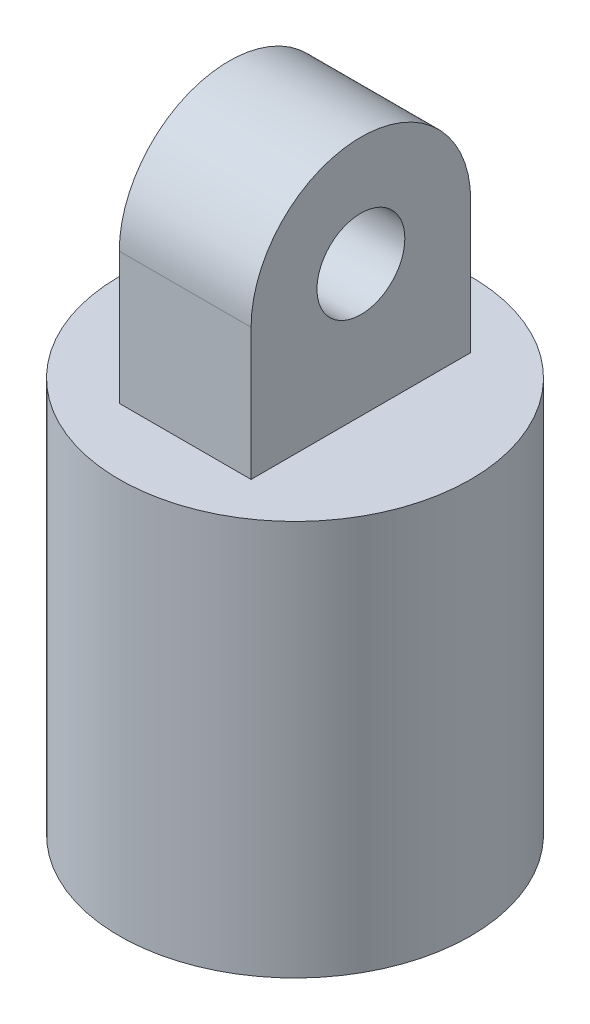
ISO-10303-21;
HEADER;
FILE_DESCRIPTION(('STEP AP214'),'2;1');
FILE_NAME('part.step','',(''),(''),'','','');
FILE_SCHEMA(('AUTOMOTIVE_DESIGN { 1 0 10303 214 1 1 1 1 }'));
ENDSEC;
DATA;
#1=APPLICATION_CONTEXT('core data for automotive mechanical design processes');
#2=APPLICATION_PROTOCOL_DEFINITION('international standard','automotive_design',2000,#1);
#3=PRODUCT_CONTEXT('',#1,'mechanical');
#4=PRODUCT('Part','Part','',(#3));
#5=PRODUCT_RELATED_PRODUCT_CATEGORY('part','',(#4));
#6=PRODUCT_DEFINITION_FORMATION('','',#4);
#7=PRODUCT_DEFINITION_CONTEXT('part definition',#1,'design');
#8=PRODUCT_DEFINITION('design','',#6,#7);
#9=PRODUCT_DEFINITION_SHAPE('','',#8);
#10=(LENGTH_UNIT() NAMED_UNIT(*) SI_UNIT(.MILLI.,.METRE.));
#11=(NAMED_UNIT(*) PLANE_ANGLE_UNIT() SI_UNIT($,.RADIAN.));
#12=(NAMED_UNIT(*) SI_UNIT($,.STERADIAN.) SOLID_ANGLE_UNIT());
#13=UNCERTAINTY_MEASURE_WITH_UNIT(LENGTH_MEASURE(1.E-05),#10,'distance_accuracy_value','');
#14=(GEOMETRIC_REPRESENTATION_CONTEXT(3) GLOBAL_UNCERTAINTY_ASSIGNED_CONTEXT((#13)) GLOBAL_UNIT_ASSIGNED_CONTEXT((#10,
#11,#12)) REPRESENTATION_CONTEXT('',''));
#15=CARTESIAN_POINT('',(0.,0.,0.));
#16=DIRECTION('',(0.,0.,1.));
#17=DIRECTION('',(1.,0.,0.));
#18=AXIS2_PLACEMENT_3D('',#15,#16,#17);
#19=CARTESIAN_POINT('',(0.,0.,0.));
#20=DIRECTION('',(0.,-1.,0.));
#21=DIRECTION('',(1.,0.,0.));
#22=AXIS2_PLACEMENT_3D('',#19,#20,#21);
#23=PLANE('',#22);
#24=CARTESIAN_POINT('',(0.,0.,0.));
#25=DIRECTION('',(0.,1.,0.));
#26=DIRECTION('',(-1.,0.,0.));
#27=AXIS2_PLACEMENT_3D('',#24,#25,#26);
#28=CIRCLE('',#27,40.);
#29=CARTESIAN_POINT('',(-40.,0.,0.));
#30=VERTEX_POINT('',#29);
#31=EDGE_CURVE('E11',#30,#30,#28,.T.);
#32=ORIENTED_EDGE('',*,*,#31,.T.);
#33=EDGE_LOOP('',(#32));
#34=FACE_BOUND('',#33,.T.);
#35=DIRECTION('',(-1.,0.,0.));
#36=VECTOR('',#35,1.);
#37=CARTESIAN_POINT('',(15.,0.,25.));
#38=LINE('',#37,#36);
#39=CARTESIAN_POINT('',(15.,0.,25.));
#40=VERTEX_POINT('',#39);
#41=CARTESIAN_POINT('',(-15.,0.,25.));
#42=VERTEX_POINT('',#41);
#43=EDGE_CURVE('E52',#40,#42,#38,.T.);
#44=ORIENTED_EDGE('',*,*,#43,.T.);
#45=DIRECTION('',(0.,0.,-1.));
#46=VECTOR('',#45,1.);
#47=CARTESIAN_POINT('',(-15.,0.,25.));
#48=LINE('',#47,#46);
#49=CARTESIAN_POINT('',(-15.,0.,-25.));
#50=VERTEX_POINT('',#49);
#51=EDGE_CURVE('E225',#42,#50,#48,.T.);
#52=ORIENTED_EDGE('',*,*,#51,.T.);
#53=DIRECTION('',(-1.,0.,0.));
#54=VECTOR('',#53,1.);
#55=CARTESIAN_POINT('',(15.,0.,-25.));
#56=LINE('',#55,#54);
#57=CARTESIAN_POINT('',(15.,0.,-25.));
#58=VERTEX_POINT('',#57);
#59=EDGE_CURVE('E98',#58,#50,#56,.T.);
#60=ORIENTED_EDGE('',*,*,#59,.F.);
#61=DIRECTION('',(0.,0.,-1.));
#62=VECTOR('',#61,1.);
#63=CARTESIAN_POINT('',(15.,0.,25.));
#64=LINE('',#63,#62);
#65=EDGE_CURVE('E47',#40,#58,#64,.T.);
#66=ORIENTED_EDGE('',*,*,#65,.F.);
#67=EDGE_LOOP('',(#44,#52,#60,#66));
#68=FACE_BOUND('',#67,.T.);
#69=ADVANCED_FACE('F33',(#34,#68),#23,.F.);
#70=CARTESIAN_POINT('',(0.,-10.,0.));
#71=DIRECTION('',(0.,1.,0.));
#72=DIRECTION('',(-1.,0.,0.));
#73=AXIS2_PLACEMENT_3D('',#70,#71,#72);
#74=CYLINDRICAL_SURFACE('',#73,40.);
#75=ORIENTED_EDGE('',*,*,#31,.F.);
#76=EDGE_LOOP('',(#75));
#77=FACE_BOUND('',#76,.T.);
#78=CARTESIAN_POINT('',(0.,-90.,0.));
#79=DIRECTION('',(0.,1.,0.));
#80=DIRECTION('',(-1.,0.,0.));
#81=AXIS2_PLACEMENT_3D('',#78,#79,#80);
#82=CIRCLE('',#81,40.);
#83=CARTESIAN_POINT('',(-40.,-90.,0.));
#84=VERTEX_POINT('',#83);
#85=EDGE_CURVE('E40',#84,#84,#82,.T.);
#86=ORIENTED_EDGE('',*,*,#85,.T.);
#87=EDGE_LOOP('',(#86));
#88=FACE_BOUND('',#87,.T.);
#89=ADVANCED_FACE('F106',(#77,#88),#74,.T.);
#90=CARTESIAN_POINT('',(40.,-90.,0.));
#91=DIRECTION('',(0.,1.,0.));
#92=DIRECTION('',(-1.,0.,0.));
#93=AXIS2_PLACEMENT_3D('',#90,#91,#92);
#94=PLANE('',#93);
#95=ORIENTED_EDGE('',*,*,#85,.F.);
#96=EDGE_LOOP('',(#95));
#97=FACE_BOUND('',#96,.T.);
#98=CARTESIAN_POINT('',(0.,-90.,0.));
#99=DIRECTION('',(0.,1.,0.));
#100=DIRECTION('',(-1.,0.,0.));
#101=AXIS2_PLACEMENT_3D('',#98,#99,#100);
#102=CIRCLE('',#101,30.);
#103=CARTESIAN_POINT('',(-30.,-90.,0.));
#104=VERTEX_POINT('',#103);
#105=EDGE_CURVE('E96',#104,#104,#102,.T.);
#106=ORIENTED_EDGE('',*,*,#105,.T.);
#107=EDGE_LOOP('',(#106));
#108=FACE_BOUND('',#107,.T.);
#109=ADVANCED_FACE('F108',(#97,#108),#94,.F.);
#110=CARTESIAN_POINT('',(0.,-10.,0.));
#111=DIRECTION('',(0.,1.,0.));
#112=DIRECTION('',(-1.,0.,0.));
#113=AXIS2_PLACEMENT_3D('',#110,#111,#112);
#114=CYLINDRICAL_SURFACE('',#113,30.);
#115=ORIENTED_EDGE('',*,*,#105,.F.);
#116=EDGE_LOOP('',(#115));
#117=FACE_BOUND('',#116,.T.);
#118=CARTESIAN_POINT('',(0.,-10.,0.));
#119=DIRECTION('',(0.,1.,0.));
#120=DIRECTION('',(-1.,0.,0.));
#121=AXIS2_PLACEMENT_3D('',#118,#119,#120);
#122=CIRCLE('',#121,30.);
#123=CARTESIAN_POINT('',(-30.,-10.,0.));
#124=VERTEX_POINT('',#123);
#125=EDGE_CURVE('E93',#124,#124,#122,.T.);
#126=ORIENTED_EDGE('',*,*,#125,.T.);
#127=EDGE_LOOP('',(#126));
#128=FACE_BOUND('',#127,.T.);
#129=ADVANCED_FACE('F111',(#117,#128),#114,.F.);
#130=CARTESIAN_POINT('',(30.,-10.,0.));
#131=DIRECTION('',(0.,1.,0.));
#132=DIRECTION('',(-1.,0.,0.));
#133=AXIS2_PLACEMENT_3D('',#130,#131,#132);
#134=PLANE('',#133);
#135=ORIENTED_EDGE('',*,*,#125,.F.);
#136=EDGE_LOOP('',(#135));
#137=FACE_BOUND('',#136,.T.);
#138=ADVANCED_FACE('F117',(#137),#134,.F.);
#139=CARTESIAN_POINT('',(15.,30.,0.));
#140=DIRECTION('',(1.,0.,0.));
#141=DIRECTION('',(0.,0.,-1.));
#142=AXIS2_PLACEMENT_3D('',#139,#140,#141);
#143=PLANE('',#142);
#144=CARTESIAN_POINT('',(15.,30.,0.));
#145=DIRECTION('',(1.,0.,0.));
#146=DIRECTION('',(0.,0.,-1.));
#147=AXIS2_PLACEMENT_3D('',#144,#145,#146);
#148=CIRCLE('',#147,25.);
#149=CARTESIAN_POINT('',(15.,30.,-25.));
#150=VERTEX_POINT('',#149);
#151=CARTESIAN_POINT('',(15.,30.,25.));
#152=VERTEX_POINT('',#151);
#153=EDGE_CURVE('E78',#150,#152,#148,.T.);
#154=ORIENTED_EDGE('',*,*,#153,.T.);
#155=DIRECTION('',(0.,-1.,0.));
#156=VECTOR('',#155,1.);
#157=CARTESIAN_POINT('',(15.,30.,25.));
#158=LINE('',#157,#156);
#159=EDGE_CURVE('E71',#152,#40,#158,.T.);
#160=ORIENTED_EDGE('',*,*,#159,.T.);
#161=ORIENTED_EDGE('',*,*,#65,.T.);
#162=DIRECTION('',(0.,1.,0.));
#163=VECTOR('',#162,1.);
#164=CARTESIAN_POINT('',(15.,0.,-25.));
#165=LINE('',#164,#163);
#166=EDGE_CURVE('E84',#58,#150,#165,.T.);
#167=ORIENTED_EDGE('',*,*,#166,.T.);
#168=EDGE_LOOP('',(#154,#160,#161,#167));
#169=FACE_BOUND('',#168,.T.);
#170=CARTESIAN_POINT('',(15.,30.,0.));
#171=DIRECTION('',(1.,0.,0.));
#172=DIRECTION('',(0.,0.,-1.));
#173=AXIS2_PLACEMENT_3D('',#170,#171,#172);
#174=CIRCLE('',#173,10.);
#175=CARTESIAN_POINT('',(15.,30.,-10.));
#176=VERTEX_POINT('',#175);
#177=EDGE_CURVE('E211',#176,#176,#174,.T.);
#178=ORIENTED_EDGE('',*,*,#177,.F.);
#179=EDGE_LOOP('',(#178));
#180=FACE_BOUND('',#179,.T.);
#181=ADVANCED_FACE('F81',(#169,#180),#143,.T.);
#182=CARTESIAN_POINT('',(-15.,30.,0.));
#183=DIRECTION('',(1.,0.,0.));
#184=DIRECTION('',(0.,0.,-1.));
#185=AXIS2_PLACEMENT_3D('',#182,#183,#184);
#186=PLANE('',#185);
#187=CARTESIAN_POINT('',(-15.,30.,0.));
#188=DIRECTION('',(1.,0.,0.));
#189=DIRECTION('',(0.,0.,-1.));
#190=AXIS2_PLACEMENT_3D('',#187,#188,#189);
#191=CIRCLE('',#190,25.);
#192=CARTESIAN_POINT('',(-15.,30.,-25.));
#193=VERTEX_POINT('',#192);
#194=CARTESIAN_POINT('',(-15.,30.,25.));
#195=VERTEX_POINT('',#194);
#196=EDGE_CURVE('E92',#193,#195,#191,.T.);
#197=ORIENTED_EDGE('',*,*,#196,.F.);
#198=DIRECTION('',(0.,1.,0.));
#199=VECTOR('',#198,1.);
#200=CARTESIAN_POINT('',(-15.,0.,-25.));
#201=LINE('',#200,#199);
#202=EDGE_CURVE('E88',#50,#193,#201,.T.);
#203=ORIENTED_EDGE('',*,*,#202,.F.);
#204=ORIENTED_EDGE('',*,*,#51,.F.);
#205=DIRECTION('',(0.,-1.,0.));
#206=VECTOR('',#205,1.);
#207=CARTESIAN_POINT('',(-15.,30.,25.));
#208=LINE('',#207,#206);
#209=EDGE_CURVE('E223',#195,#42,#208,.T.);
#210=ORIENTED_EDGE('',*,*,#209,.F.);
#211=EDGE_LOOP('',(#197,#203,#204,#210));
#212=FACE_BOUND('',#211,.T.);
#213=CARTESIAN_POINT('',(-15.,30.,0.));
#214=DIRECTION('',(1.,0.,0.));
#215=DIRECTION('',(0.,0.,-1.));
#216=AXIS2_PLACEMENT_3D('',#213,#214,#215);
#217=CIRCLE('',#216,10.);
#218=CARTESIAN_POINT('',(-15.,30.,-10.));
#219=VERTEX_POINT('',#218);
#220=EDGE_CURVE('E214',#219,#219,#217,.T.);
#221=ORIENTED_EDGE('',*,*,#220,.T.);
#222=EDGE_LOOP('',(#221));
#223=FACE_BOUND('',#222,.T.);
#224=ADVANCED_FACE('F126',(#212,#223),#186,.F.);
#225=CARTESIAN_POINT('',(15.,30.,0.));
#226=DIRECTION('',(-1.,0.,0.));
#227=DIRECTION('',(0.,0.,1.));
#228=AXIS2_PLACEMENT_3D('',#225,#226,#227);
#229=CYLINDRICAL_SURFACE('',#228,25.);
#230=ORIENTED_EDGE('',*,*,#196,.T.);
#231=DIRECTION('',(-1.,0.,0.));
#232=VECTOR('',#231,1.);
#233=CARTESIAN_POINT('',(15.,30.,25.));
#234=LINE('',#233,#232);
#235=EDGE_CURVE('E75',#152,#195,#234,.T.);
#236=ORIENTED_EDGE('',*,*,#235,.F.);
#237=ORIENTED_EDGE('',*,*,#153,.F.);
#238=DIRECTION('',(-1.,0.,0.));
#239=VECTOR('',#238,1.);
#240=CARTESIAN_POINT('',(15.,30.,-25.));
#241=LINE('',#240,#239);
#242=EDGE_CURVE('E221',#150,#193,#241,.T.);
#243=ORIENTED_EDGE('',*,*,#242,.T.);
#244=EDGE_LOOP('',(#230,#236,#237,#243));
#245=FACE_BOUND('',#244,.T.);
#246=ADVANCED_FACE('F90',(#245),#229,.T.);
#247=CARTESIAN_POINT('',(15.,30.,25.));
#248=DIRECTION('',(0.,0.,-1.));
#249=DIRECTION('',(-1.,0.,0.));
#250=AXIS2_PLACEMENT_3D('',#247,#248,#249);
#251=PLANE('',#250);
#252=ORIENTED_EDGE('',*,*,#209,.T.);
#253=ORIENTED_EDGE('',*,*,#43,.F.);
#254=ORIENTED_EDGE('',*,*,#159,.F.);
#255=ORIENTED_EDGE('',*,*,#235,.T.);
#256=EDGE_LOOP('',(#252,#253,#254,#255));
#257=FACE_BOUND('',#256,.T.);
#258=ADVANCED_FACE('F73',(#257),#251,.F.);
#259=CARTESIAN_POINT('',(15.,0.,-25.));
#260=DIRECTION('',(0.,0.,1.));
#261=DIRECTION('',(1.,0.,0.));
#262=AXIS2_PLACEMENT_3D('',#259,#260,#261);
#263=PLANE('',#262);
#264=ORIENTED_EDGE('',*,*,#202,.T.);
#265=ORIENTED_EDGE('',*,*,#242,.F.);
#266=ORIENTED_EDGE('',*,*,#166,.F.);
#267=ORIENTED_EDGE('',*,*,#59,.T.);
#268=EDGE_LOOP('',(#264,#265,#266,#267));
#269=FACE_BOUND('',#268,.T.);
#270=ADVANCED_FACE('F185',(#269),#263,.F.);
#271=CARTESIAN_POINT('',(15.,30.,0.));
#272=DIRECTION('',(-1.,0.,0.));
#273=DIRECTION('',(0.,0.,1.));
#274=AXIS2_PLACEMENT_3D('',#271,#272,#273);
#275=CYLINDRICAL_SURFACE('',#274,10.);
#276=ORIENTED_EDGE('',*,*,#177,.T.);
#277=EDGE_LOOP('',(#276));
#278=FACE_BOUND('',#277,.T.);
#279=ORIENTED_EDGE('',*,*,#220,.F.);
#280=EDGE_LOOP('',(#279));
#281=FACE_BOUND('',#280,.T.);
#282=ADVANCED_FACE('F194',(#278,#281),#275,.F.);
#283=CLOSED_SHELL('',(#69,#89,#109,#129,#138,#181,#224,#246,#258,#270,#282));
#284=MANIFOLD_SOLID_BREP('B2',#283);
#285=ADVANCED_BREP_SHAPE_REPRESENTATION('',(#18,#284),#14);
#286=SHAPE_DEFINITION_REPRESENTATION(#9,#285);
ENDSEC;
END-ISO-10303-21;
